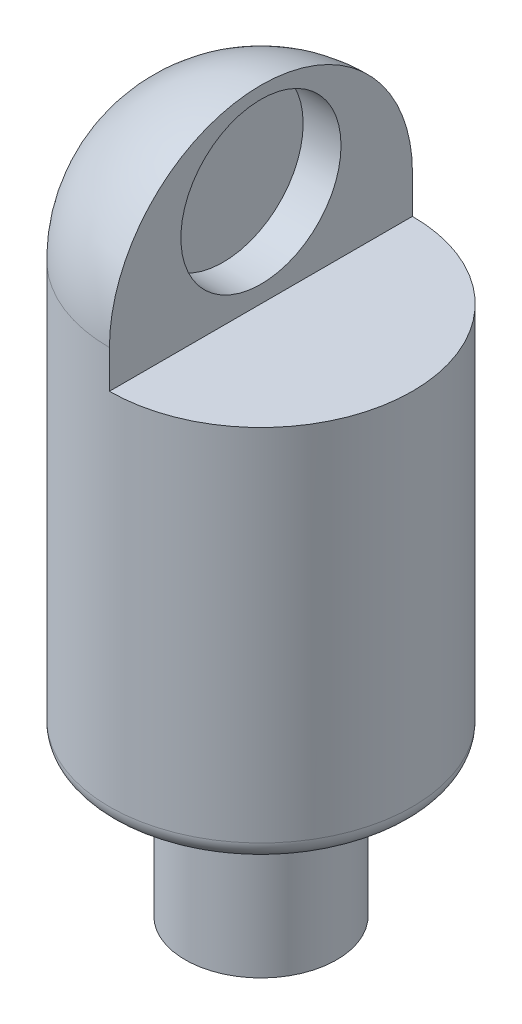
ISO-10303-21;
HEADER;
FILE_DESCRIPTION(('STEP AP214'),'2;1');
FILE_NAME('part.step','',(''),(''),'','','');
FILE_SCHEMA(('AUTOMOTIVE_DESIGN { 1 0 10303 214 1 1 1 1 }'));
ENDSEC;
DATA;
#1=APPLICATION_CONTEXT('core data for automotive mechanical design processes');
#2=APPLICATION_PROTOCOL_DEFINITION('international standard','automotive_design',2000,#1);
#3=PRODUCT_CONTEXT('',#1,'mechanical');
#4=PRODUCT('Part','Part','',(#3));
#5=PRODUCT_RELATED_PRODUCT_CATEGORY('part','',(#4));
#6=PRODUCT_DEFINITION_FORMATION('','',#4);
#7=PRODUCT_DEFINITION_CONTEXT('part definition',#1,'design');
#8=PRODUCT_DEFINITION('design','',#6,#7);
#9=PRODUCT_DEFINITION_SHAPE('','',#8);
#10=(LENGTH_UNIT() NAMED_UNIT(*) SI_UNIT(.MILLI.,.METRE.));
#11=(NAMED_UNIT(*) PLANE_ANGLE_UNIT() SI_UNIT($,.RADIAN.));
#12=(NAMED_UNIT(*) SI_UNIT($,.STERADIAN.) SOLID_ANGLE_UNIT());
#13=UNCERTAINTY_MEASURE_WITH_UNIT(LENGTH_MEASURE(1.E-05),#10,'distance_accuracy_value','');
#14=(GEOMETRIC_REPRESENTATION_CONTEXT(3) GLOBAL_UNCERTAINTY_ASSIGNED_CONTEXT((#13)) GLOBAL_UNIT_ASSIGNED_CONTEXT((#10,
#11,#12)) REPRESENTATION_CONTEXT('',''));
#15=CARTESIAN_POINT('',(0.,0.,0.));
#16=DIRECTION('',(0.,0.,1.));
#17=DIRECTION('',(1.,0.,0.));
#18=AXIS2_PLACEMENT_3D('',#15,#16,#17);
#19=CARTESIAN_POINT('',(0.,150.,0.));
#20=DIRECTION('',(0.,-1.,0.));
#21=DIRECTION('',(0.,0.,-1.));
#22=AXIS2_PLACEMENT_3D('',#19,#20,#21);
#23=CYLINDRICAL_SURFACE('',#22,40.);
#24=CARTESIAN_POINT('',(0.,5.,0.));
#25=DIRECTION('',(0.,1.,0.));
#26=DIRECTION('',(0.,0.,1.));
#27=AXIS2_PLACEMENT_3D('',#24,#25,#26);
#28=CIRCLE('',#27,40.);
#29=CARTESIAN_POINT('',(0.,5.,40.));
#30=VERTEX_POINT('',#29);
#31=EDGE_CURVE('E41',#30,#30,#28,.T.);
#32=ORIENTED_EDGE('',*,*,#31,.T.);
#33=EDGE_LOOP('',(#32));
#34=FACE_BOUND('',#33,.T.);
#35=DIRECTION('',(0.,1.,0.));
#36=VECTOR('',#35,1.);
#37=CARTESIAN_POINT('',(0.,100.,40.));
#38=LINE('',#37,#36);
#39=CARTESIAN_POINT('',(0.,100.,40.));
#40=VERTEX_POINT('',#39);
#41=CARTESIAN_POINT('',(0.,110.,40.));
#42=VERTEX_POINT('',#41);
#43=EDGE_CURVE('E76',#40,#42,#38,.T.);
#44=ORIENTED_EDGE('',*,*,#43,.T.);
#45=CARTESIAN_POINT('',(0.,110.,0.));
#46=DIRECTION('',(0.,-1.,0.));
#47=DIRECTION('',(0.,0.,-1.));
#48=AXIS2_PLACEMENT_3D('',#45,#46,#47);
#49=CIRCLE('',#48,40.);
#50=CARTESIAN_POINT('',(0.,110.,-40.));
#51=VERTEX_POINT('',#50);
#52=EDGE_CURVE('E79',#42,#51,#49,.T.);
#53=ORIENTED_EDGE('',*,*,#52,.T.);
#54=DIRECTION('',(0.,1.,0.));
#55=VECTOR('',#54,1.);
#56=CARTESIAN_POINT('',(0.,100.,-40.));
#57=LINE('',#56,#55);
#58=CARTESIAN_POINT('',(0.,100.,-40.));
#59=VERTEX_POINT('',#58);
#60=EDGE_CURVE('E75',#59,#51,#57,.T.);
#61=ORIENTED_EDGE('',*,*,#60,.F.);
#62=CARTESIAN_POINT('',(0.,100.,0.));
#63=DIRECTION('',(0.,-1.,0.));
#64=DIRECTION('',(0.,0.,-1.));
#65=AXIS2_PLACEMENT_3D('',#62,#63,#64);
#66=CIRCLE('',#65,40.);
#67=EDGE_CURVE('E65',#59,#40,#66,.T.);
#68=ORIENTED_EDGE('',*,*,#67,.T.);
#69=EDGE_LOOP('',(#44,#53,#61,#68));
#70=FACE_BOUND('',#69,.T.);
#71=ADVANCED_FACE('F33',(#34,#70),#23,.T.);
#72=CARTESIAN_POINT('',(0.,0.,0.));
#73=DIRECTION('',(0.,1.,0.));
#74=DIRECTION('',(0.,0.,1.));
#75=AXIS2_PLACEMENT_3D('',#72,#73,#74);
#76=PLANE('',#75);
#77=CARTESIAN_POINT('',(0.,0.,0.));
#78=DIRECTION('',(0.,1.,0.));
#79=DIRECTION('',(0.,0.,1.));
#80=AXIS2_PLACEMENT_3D('',#77,#78,#79);
#81=CIRCLE('',#80,35.);
#82=CARTESIAN_POINT('',(0.,0.,35.));
#83=VERTEX_POINT('',#82);
#84=EDGE_CURVE('E11',#83,#83,#81,.F.);
#85=ORIENTED_EDGE('',*,*,#84,.T.);
#86=EDGE_LOOP('',(#85));
#87=FACE_BOUND('',#86,.T.);
#88=CARTESIAN_POINT('',(0.,0.,0.));
#89=DIRECTION('',(0.,-1.,0.));
#90=DIRECTION('',(0.,0.,-1.));
#91=AXIS2_PLACEMENT_3D('',#88,#89,#90);
#92=CIRCLE('',#91,20.);
#93=CARTESIAN_POINT('',(0.,0.,-20.));
#94=VERTEX_POINT('',#93);
#95=EDGE_CURVE('E71',#94,#94,#92,.T.);
#96=ORIENTED_EDGE('',*,*,#95,.F.);
#97=EDGE_LOOP('',(#96));
#98=FACE_BOUND('',#97,.T.);
#99=ADVANCED_FACE('F103',(#87,#98),#76,.F.);
#100=CARTESIAN_POINT('',(0.,-40.,0.));
#101=DIRECTION('',(0.,1.,0.));
#102=DIRECTION('',(0.,0.,1.));
#103=AXIS2_PLACEMENT_3D('',#100,#101,#102);
#104=CYLINDRICAL_SURFACE('',#103,20.);
#105=CARTESIAN_POINT('',(0.,-40.,0.));
#106=DIRECTION('',(0.,-1.,0.));
#107=DIRECTION('',(0.,0.,-1.));
#108=AXIS2_PLACEMENT_3D('',#105,#106,#107);
#109=CIRCLE('',#108,20.);
#110=CARTESIAN_POINT('',(0.,-40.,-20.));
#111=VERTEX_POINT('',#110);
#112=EDGE_CURVE('E81',#111,#111,#109,.T.);
#113=ORIENTED_EDGE('',*,*,#112,.F.);
#114=EDGE_LOOP('',(#113));
#115=FACE_BOUND('',#114,.T.);
#116=ORIENTED_EDGE('',*,*,#95,.T.);
#117=EDGE_LOOP('',(#116));
#118=FACE_BOUND('',#117,.T.);
#119=ADVANCED_FACE('F109',(#115,#118),#104,.T.);
#120=CARTESIAN_POINT('',(0.,-40.,0.));
#121=DIRECTION('',(0.,-1.,0.));
#122=DIRECTION('',(0.,0.,-1.));
#123=AXIS2_PLACEMENT_3D('',#120,#121,#122);
#124=PLANE('',#123);
#125=ORIENTED_EDGE('',*,*,#112,.T.);
#126=EDGE_LOOP('',(#125));
#127=FACE_BOUND('',#126,.T.);
#128=ADVANCED_FACE('F115',(#127),#124,.T.);
#129=CARTESIAN_POINT('',(0.,100.,0.));
#130=DIRECTION('',(0.,-1.,0.));
#131=DIRECTION('',(0.,0.,-1.));
#132=AXIS2_PLACEMENT_3D('',#129,#130,#131);
#133=PLANE('',#132);
#134=DIRECTION('',(0.,0.,1.));
#135=VECTOR('',#134,1.);
#136=CARTESIAN_POINT('',(0.,100.,-40.));
#137=LINE('',#136,#135);
#138=EDGE_CURVE('E68',#59,#40,#137,.T.);
#139=ORIENTED_EDGE('',*,*,#138,.T.);
#140=ORIENTED_EDGE('',*,*,#67,.F.);
#141=EDGE_LOOP('',(#139,#140));
#142=FACE_BOUND('',#141,.T.);
#143=ADVANCED_FACE('F67',(#142),#133,.F.);
#144=CARTESIAN_POINT('',(0.,100.,-40.));
#145=DIRECTION('',(-1.,0.,0.));
#146=DIRECTION('',(0.,0.,1.));
#147=AXIS2_PLACEMENT_3D('',#144,#145,#146);
#148=PLANE('',#147);
#149=CARTESIAN_POINT('',(0.,125.623024500447,0.));
#150=DIRECTION('',(1.,0.,0.));
#151=DIRECTION('',(0.,0.,-1.));
#152=AXIS2_PLACEMENT_3D('',#149,#150,#151);
#153=CIRCLE('',#152,21.1417997955597);
#154=CARTESIAN_POINT('',(0.,125.623024500447,-21.1417997955597));
#155=VERTEX_POINT('',#154);
#156=EDGE_CURVE('E135',#155,#155,#153,.T.);
#157=ORIENTED_EDGE('',*,*,#156,.F.);
#158=EDGE_LOOP('',(#157));
#159=FACE_BOUND('',#158,.T.);
#160=CARTESIAN_POINT('',(0.,110.,0.));
#161=DIRECTION('',(-1.,0.,0.));
#162=DIRECTION('',(0.,0.,1.));
#163=AXIS2_PLACEMENT_3D('',#160,#161,#162);
#164=CIRCLE('',#163,40.);
#165=CARTESIAN_POINT('',(0.,150.,0.));
#166=VERTEX_POINT('',#165);
#167=EDGE_CURVE('E48',#51,#166,#164,.F.);
#168=ORIENTED_EDGE('',*,*,#167,.T.);
#169=CARTESIAN_POINT('',(0.,110.,0.));
#170=DIRECTION('',(-1.,0.,0.));
#171=DIRECTION('',(0.,0.,1.));
#172=AXIS2_PLACEMENT_3D('',#169,#170,#171);
#173=CIRCLE('',#172,40.);
#174=EDGE_CURVE('E54',#166,#42,#173,.F.);
#175=ORIENTED_EDGE('',*,*,#174,.T.);
#176=ORIENTED_EDGE('',*,*,#43,.F.);
#177=ORIENTED_EDGE('',*,*,#138,.F.);
#178=ORIENTED_EDGE('',*,*,#60,.T.);
#179=EDGE_LOOP('',(#168,#175,#176,#177,#178));
#180=FACE_BOUND('',#179,.T.);
#181=ADVANCED_FACE('F74',(#159,#180),#148,.F.);
#182=CARTESIAN_POINT('',(-10.,125.623024500447,0.));
#183=DIRECTION('',(1.,0.,0.));
#184=DIRECTION('',(0.,0.,-1.));
#185=AXIS2_PLACEMENT_3D('',#182,#183,#184);
#186=CYLINDRICAL_SURFACE('',#185,21.1417997955597);
#187=CARTESIAN_POINT('',(-10.,125.623024500447,0.));
#188=DIRECTION('',(1.,0.,0.));
#189=DIRECTION('',(0.,0.,-1.));
#190=AXIS2_PLACEMENT_3D('',#187,#188,#189);
#191=CIRCLE('',#190,21.1417997955597);
#192=CARTESIAN_POINT('',(-10.,125.623024500447,-21.1417997955597));
#193=VERTEX_POINT('',#192);
#194=EDGE_CURVE('E77',#193,#193,#191,.T.);
#195=ORIENTED_EDGE('',*,*,#194,.F.);
#196=EDGE_LOOP('',(#195));
#197=FACE_BOUND('',#196,.T.);
#198=ORIENTED_EDGE('',*,*,#156,.T.);
#199=EDGE_LOOP('',(#198));
#200=FACE_BOUND('',#199,.T.);
#201=ADVANCED_FACE('F122',(#197,#200),#186,.F.);
#202=CARTESIAN_POINT('',(-10.,125.623024500447,0.));
#203=DIRECTION('',(1.,0.,0.));
#204=DIRECTION('',(0.,0.,-1.));
#205=AXIS2_PLACEMENT_3D('',#202,#203,#204);
#206=PLANE('',#205);
#207=ORIENTED_EDGE('',*,*,#194,.T.);
#208=EDGE_LOOP('',(#207));
#209=FACE_BOUND('',#208,.T.);
#210=ADVANCED_FACE('F100',(#209),#206,.T.);
#211=CARTESIAN_POINT('',(0.,110.,0.));
#212=DIRECTION('',(0.,1.,0.));
#213=DIRECTION('',(0.,0.,1.));
#214=AXIS2_PLACEMENT_3D('',#211,#212,#213);
#215=SPHERICAL_SURFACE('',#214,40.);
#216=ORIENTED_EDGE('',*,*,#167,.F.);
#217=ORIENTED_EDGE('',*,*,#52,.F.);
#218=ORIENTED_EDGE('',*,*,#174,.F.);
#219=EDGE_LOOP('',(#216,#217,#218));
#220=FACE_BOUND('',#219,.T.);
#221=ADVANCED_FACE('F95',(#220),#215,.T.);
#222=CARTESIAN_POINT('',(0.,5.,0.));
#223=DIRECTION('',(0.,1.,0.));
#224=DIRECTION('',(0.,0.,1.));
#225=AXIS2_PLACEMENT_3D('',#222,#223,#224);
#226=TOROIDAL_SURFACE('',#225,35.,5.);
#227=ORIENTED_EDGE('',*,*,#84,.F.);
#228=EDGE_LOOP('',(#227));
#229=FACE_BOUND('',#228,.T.);
#230=ORIENTED_EDGE('',*,*,#31,.F.);
#231=EDGE_LOOP('',(#230));
#232=FACE_BOUND('',#231,.T.);
#233=ADVANCED_FACE('F35',(#229,#232),#226,.T.);
#234=CLOSED_SHELL('',(#71,#99,#119,#128,#143,#181,#201,#210,#221,#233));
#235=MANIFOLD_SOLID_BREP('B2',#234);
#236=ADVANCED_BREP_SHAPE_REPRESENTATION('',(#18,#235),#14);
#237=SHAPE_DEFINITION_REPRESENTATION(#9,#236);
ENDSEC;
END-ISO-10303-21;
